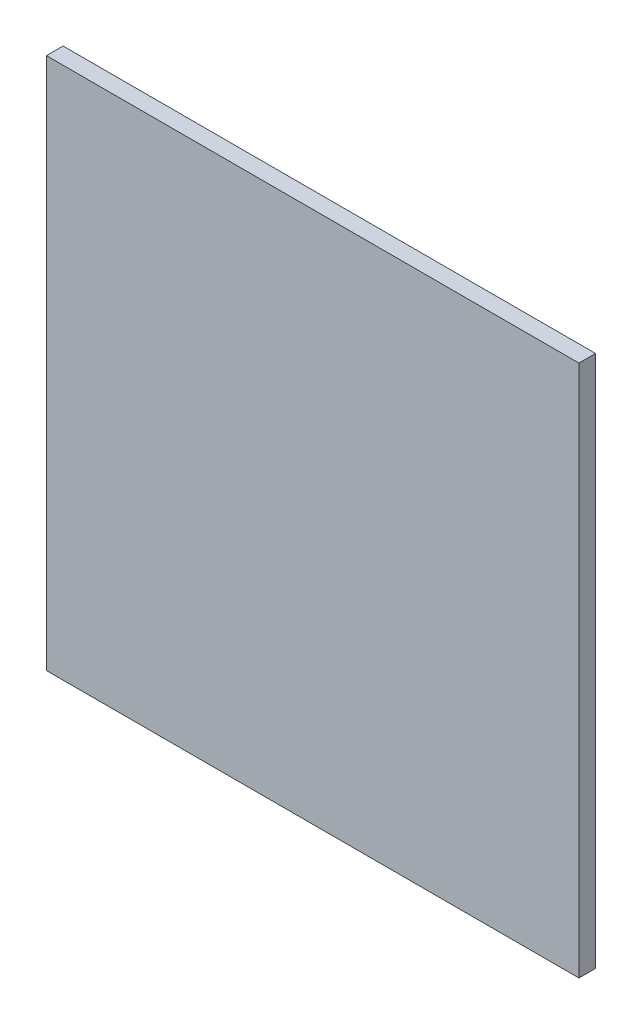
ISO-10303-21;
HEADER;
FILE_DESCRIPTION(('STEP AP214'),'2;1');
FILE_NAME('part.step','',(''),(''),'','','');
FILE_SCHEMA(('AUTOMOTIVE_DESIGN { 1 0 10303 214 1 1 1 1 }'));
ENDSEC;
DATA;
#1=APPLICATION_CONTEXT('core data for automotive mechanical design processes');
#2=APPLICATION_PROTOCOL_DEFINITION('international standard','automotive_design',2000,#1);
#3=PRODUCT_CONTEXT('',#1,'mechanical');
#4=PRODUCT('Part','Part','',(#3));
#5=PRODUCT_RELATED_PRODUCT_CATEGORY('part','',(#4));
#6=PRODUCT_DEFINITION_FORMATION('','',#4);
#7=PRODUCT_DEFINITION_CONTEXT('part definition',#1,'design');
#8=PRODUCT_DEFINITION('design','',#6,#7);
#9=PRODUCT_DEFINITION_SHAPE('','',#8);
#10=(LENGTH_UNIT() NAMED_UNIT(*) SI_UNIT(.MILLI.,.METRE.));
#11=(NAMED_UNIT(*) PLANE_ANGLE_UNIT() SI_UNIT($,.RADIAN.));
#12=(NAMED_UNIT(*) SI_UNIT($,.STERADIAN.) SOLID_ANGLE_UNIT());
#13=UNCERTAINTY_MEASURE_WITH_UNIT(LENGTH_MEASURE(1.E-05),#10,'distance_accuracy_value','');
#14=(GEOMETRIC_REPRESENTATION_CONTEXT(3) GLOBAL_UNCERTAINTY_ASSIGNED_CONTEXT((#13)) GLOBAL_UNIT_ASSIGNED_CONTEXT((#10,
#11,#12)) REPRESENTATION_CONTEXT('',''));
#15=CARTESIAN_POINT('',(0.,0.,0.));
#16=DIRECTION('',(0.,0.,1.));
#17=DIRECTION('',(1.,0.,0.));
#18=AXIS2_PLACEMENT_3D('',#15,#16,#17);
#19=CARTESIAN_POINT('',(0.,0.,-58.));
#20=DIRECTION('',(0.,0.,-1.));
#21=DIRECTION('',(-1.,0.,0.));
#22=AXIS2_PLACEMENT_3D('',#19,#20,#21);
#23=PLANE('',#22);
#24=DIRECTION('',(0.,-1.,0.));
#25=VECTOR('',#24,1.);
#26=CARTESIAN_POINT('',(-130.,30.,-58.));
#27=LINE('',#26,#25);
#28=CARTESIAN_POINT('',(-130.,30.,-58.));
#29=VERTEX_POINT('',#28);
#30=CARTESIAN_POINT('',(-130.,-130.,-58.));
#31=VERTEX_POINT('',#30);
#32=EDGE_CURVE('E305',#29,#31,#27,.T.);
#33=ORIENTED_EDGE('',*,*,#32,.F.);
#34=DIRECTION('',(-1.,0.,0.));
#35=VECTOR('',#34,1.);
#36=CARTESIAN_POINT('',(30.,30.,-58.));
#37=LINE('',#36,#35);
#38=CARTESIAN_POINT('',(30.,30.,-58.));
#39=VERTEX_POINT('',#38);
#40=EDGE_CURVE('E318',#39,#29,#37,.T.);
#41=ORIENTED_EDGE('',*,*,#40,.F.);
#42=DIRECTION('',(0.,1.,0.));
#43=VECTOR('',#42,1.);
#44=CARTESIAN_POINT('',(30.,30.,-58.));
#45=LINE('',#44,#43);
#46=CARTESIAN_POINT('',(30.,-130.,-58.));
#47=VERTEX_POINT('',#46);
#48=EDGE_CURVE('E314',#47,#39,#45,.T.);
#49=ORIENTED_EDGE('',*,*,#48,.F.);
#50=DIRECTION('',(1.,0.,0.));
#51=VECTOR('',#50,1.);
#52=CARTESIAN_POINT('',(30.,-130.,-58.));
#53=LINE('',#52,#51);
#54=EDGE_CURVE('E309',#31,#47,#53,.T.);
#55=ORIENTED_EDGE('',*,*,#54,.F.);
#56=EDGE_LOOP('',(#33,#41,#49,#55));
#57=FACE_BOUND('',#56,.T.);
#58=DIRECTION('',(-1.,0.,0.));
#59=VECTOR('',#58,1.);
#60=CARTESIAN_POINT('',(0.,20.,-58.));
#61=LINE('',#60,#59);
#62=CARTESIAN_POINT('',(20.,20.,-58.));
#63=VERTEX_POINT('',#62);
#64=CARTESIAN_POINT('',(-120.,20.,-58.));
#65=VERTEX_POINT('',#64);
#66=EDGE_CURVE('E273',#63,#65,#61,.T.);
#67=ORIENTED_EDGE('',*,*,#66,.T.);
#68=DIRECTION('',(0.,-1.,0.));
#69=VECTOR('',#68,1.);
#70=CARTESIAN_POINT('',(-120.,0.,-58.));
#71=LINE('',#70,#69);
#72=CARTESIAN_POINT('',(-120.,-120.,-58.));
#73=VERTEX_POINT('',#72);
#74=EDGE_CURVE('E269',#65,#73,#71,.T.);
#75=ORIENTED_EDGE('',*,*,#74,.T.);
#76=DIRECTION('',(-1.,0.,0.));
#77=VECTOR('',#76,1.);
#78=CARTESIAN_POINT('',(0.,-120.,-58.));
#79=LINE('',#78,#77);
#80=CARTESIAN_POINT('',(20.,-120.,-58.));
#81=VERTEX_POINT('',#80);
#82=EDGE_CURVE('E251',#81,#73,#79,.T.);
#83=ORIENTED_EDGE('',*,*,#82,.F.);
#84=DIRECTION('',(0.,-1.,0.));
#85=VECTOR('',#84,1.);
#86=CARTESIAN_POINT('',(20.,0.,-58.));
#87=LINE('',#86,#85);
#88=EDGE_CURVE('E277',#63,#81,#87,.T.);
#89=ORIENTED_EDGE('',*,*,#88,.F.);
#90=EDGE_LOOP('',(#67,#75,#83,#89));
#91=FACE_BOUND('',#90,.T.);
#92=ADVANCED_FACE('F45',(#57,#91),#23,.T.);
#93=CARTESIAN_POINT('',(110.,110.,10.));
#94=DIRECTION('',(-1.,0.,0.));
#95=DIRECTION('',(0.,-1.,0.));
#96=AXIS2_PLACEMENT_3D('',#93,#94,#95);
#97=PLANE('',#96);
#98=DIRECTION('',(0.,1.,0.));
#99=VECTOR('',#98,1.);
#100=CARTESIAN_POINT('',(110.,110.,0.));
#101=LINE('',#100,#99);
#102=CARTESIAN_POINT('',(110.,-210.,0.));
#103=VERTEX_POINT('',#102);
#104=CARTESIAN_POINT('',(110.,110.,0.));
#105=VERTEX_POINT('',#104);
#106=EDGE_CURVE('E341',#103,#105,#101,.T.);
#107=ORIENTED_EDGE('',*,*,#106,.T.);
#108=DIRECTION('',(0.,0.,-1.));
#109=VECTOR('',#108,1.);
#110=CARTESIAN_POINT('',(110.,110.,10.));
#111=LINE('',#110,#109);
#112=CARTESIAN_POINT('',(110.,110.,10.));
#113=VERTEX_POINT('',#112);
#114=EDGE_CURVE('E387',#113,#105,#111,.T.);
#115=ORIENTED_EDGE('',*,*,#114,.F.);
#116=DIRECTION('',(0.,1.,0.));
#117=VECTOR('',#116,1.);
#118=CARTESIAN_POINT('',(110.,110.,10.));
#119=LINE('',#118,#117);
#120=CARTESIAN_POINT('',(110.,-210.,10.));
#121=VERTEX_POINT('',#120);
#122=EDGE_CURVE('E350',#121,#113,#119,.T.);
#123=ORIENTED_EDGE('',*,*,#122,.F.);
#124=DIRECTION('',(0.,0.,-1.));
#125=VECTOR('',#124,1.);
#126=CARTESIAN_POINT('',(110.,-210.,10.));
#127=LINE('',#126,#125);
#128=EDGE_CURVE('E364',#121,#103,#127,.T.);
#129=ORIENTED_EDGE('',*,*,#128,.T.);
#130=EDGE_LOOP('',(#107,#115,#123,#129));
#131=FACE_BOUND('',#130,.T.);
#132=ADVANCED_FACE('F47',(#131),#97,.F.);
#133=CARTESIAN_POINT('',(-210.,110.,10.));
#134=DIRECTION('',(0.,-1.,0.));
#135=DIRECTION('',(0.,0.,-1.));
#136=AXIS2_PLACEMENT_3D('',#133,#134,#135);
#137=PLANE('',#136);
#138=DIRECTION('',(-1.,0.,0.));
#139=VECTOR('',#138,1.);
#140=CARTESIAN_POINT('',(-210.,110.,0.));
#141=LINE('',#140,#139);
#142=CARTESIAN_POINT('',(-210.,110.,0.));
#143=VERTEX_POINT('',#142);
#144=EDGE_CURVE('E368',#105,#143,#141,.T.);
#145=ORIENTED_EDGE('',*,*,#144,.T.);
#146=DIRECTION('',(0.,0.,-1.));
#147=VECTOR('',#146,1.);
#148=CARTESIAN_POINT('',(-210.,110.,10.));
#149=LINE('',#148,#147);
#150=CARTESIAN_POINT('',(-210.,110.,10.));
#151=VERTEX_POINT('',#150);
#152=EDGE_CURVE('E383',#151,#143,#149,.T.);
#153=ORIENTED_EDGE('',*,*,#152,.F.);
#154=DIRECTION('',(-1.,0.,0.));
#155=VECTOR('',#154,1.);
#156=CARTESIAN_POINT('',(-210.,110.,10.));
#157=LINE('',#156,#155);
#158=EDGE_CURVE('E354',#113,#151,#157,.T.);
#159=ORIENTED_EDGE('',*,*,#158,.F.);
#160=ORIENTED_EDGE('',*,*,#114,.T.);
#161=EDGE_LOOP('',(#145,#153,#159,#160));
#162=FACE_BOUND('',#161,.T.);
#163=ADVANCED_FACE('F444',(#162),#137,.F.);
#164=CARTESIAN_POINT('',(-210.,110.,10.));
#165=DIRECTION('',(1.,0.,0.));
#166=DIRECTION('',(0.,1.,0.));
#167=AXIS2_PLACEMENT_3D('',#164,#165,#166);
#168=PLANE('',#167);
#169=DIRECTION('',(0.,-1.,0.));
#170=VECTOR('',#169,1.);
#171=CARTESIAN_POINT('',(-210.,110.,0.));
#172=LINE('',#171,#170);
#173=CARTESIAN_POINT('',(-210.,-210.,0.));
#174=VERTEX_POINT('',#173);
#175=EDGE_CURVE('E371',#143,#174,#172,.T.);
#176=ORIENTED_EDGE('',*,*,#175,.T.);
#177=DIRECTION('',(0.,0.,-1.));
#178=VECTOR('',#177,1.);
#179=CARTESIAN_POINT('',(-210.,-210.,10.));
#180=LINE('',#179,#178);
#181=CARTESIAN_POINT('',(-210.,-210.,10.));
#182=VERTEX_POINT('',#181);
#183=EDGE_CURVE('E379',#182,#174,#180,.T.);
#184=ORIENTED_EDGE('',*,*,#183,.F.);
#185=DIRECTION('',(0.,-1.,0.));
#186=VECTOR('',#185,1.);
#187=CARTESIAN_POINT('',(-210.,110.,10.));
#188=LINE('',#187,#186);
#189=EDGE_CURVE('E358',#151,#182,#188,.T.);
#190=ORIENTED_EDGE('',*,*,#189,.F.);
#191=ORIENTED_EDGE('',*,*,#152,.T.);
#192=EDGE_LOOP('',(#176,#184,#190,#191));
#193=FACE_BOUND('',#192,.T.);
#194=ADVANCED_FACE('F538',(#193),#168,.F.);
#195=CARTESIAN_POINT('',(-210.,-210.,10.));
#196=DIRECTION('',(0.,1.,0.));
#197=DIRECTION('',(0.,0.,1.));
#198=AXIS2_PLACEMENT_3D('',#195,#196,#197);
#199=PLANE('',#198);
#200=DIRECTION('',(1.,0.,0.));
#201=VECTOR('',#200,1.);
#202=CARTESIAN_POINT('',(-210.,-210.,0.));
#203=LINE('',#202,#201);
#204=EDGE_CURVE('E355',#174,#103,#203,.T.);
#205=ORIENTED_EDGE('',*,*,#204,.T.);
#206=ORIENTED_EDGE('',*,*,#128,.F.);
#207=DIRECTION('',(1.,0.,0.));
#208=VECTOR('',#207,1.);
#209=CARTESIAN_POINT('',(-210.,-210.,10.));
#210=LINE('',#209,#208);
#211=EDGE_CURVE('E361',#182,#121,#210,.T.);
#212=ORIENTED_EDGE('',*,*,#211,.F.);
#213=ORIENTED_EDGE('',*,*,#183,.T.);
#214=EDGE_LOOP('',(#205,#206,#212,#213));
#215=FACE_BOUND('',#214,.T.);
#216=ADVANCED_FACE('F533',(#215),#199,.F.);
#217=CARTESIAN_POINT('',(0.,0.,10.));
#218=DIRECTION('',(0.,0.,1.));
#219=DIRECTION('',(1.,0.,0.));
#220=AXIS2_PLACEMENT_3D('',#217,#218,#219);
#221=PLANE('',#220);
#222=ORIENTED_EDGE('',*,*,#122,.T.);
#223=ORIENTED_EDGE('',*,*,#158,.T.);
#224=ORIENTED_EDGE('',*,*,#189,.T.);
#225=ORIENTED_EDGE('',*,*,#211,.T.);
#226=EDGE_LOOP('',(#222,#223,#224,#225));
#227=FACE_BOUND('',#226,.T.);
#228=ADVANCED_FACE('F530',(#227),#221,.T.);
#229=CARTESIAN_POINT('',(0.,0.,0.));
#230=DIRECTION('',(0.,0.,1.));
#231=DIRECTION('',(1.,0.,0.));
#232=AXIS2_PLACEMENT_3D('',#229,#230,#231);
#233=PLANE('',#232);
#234=DIRECTION('',(-1.,0.,0.));
#235=VECTOR('',#234,1.);
#236=CARTESIAN_POINT('',(30.,30.,0.));
#237=LINE('',#236,#235);
#238=CARTESIAN_POINT('',(30.,30.,0.));
#239=VERTEX_POINT('',#238);
#240=CARTESIAN_POINT('',(-130.,30.,0.));
#241=VERTEX_POINT('',#240);
#242=EDGE_CURVE('E310',#239,#241,#237,.T.);
#243=ORIENTED_EDGE('',*,*,#242,.T.);
#244=DIRECTION('',(0.,-1.,0.));
#245=VECTOR('',#244,1.);
#246=CARTESIAN_POINT('',(-130.,30.,0.));
#247=LINE('',#246,#245);
#248=CARTESIAN_POINT('',(-130.,-130.,0.));
#249=VERTEX_POINT('',#248);
#250=EDGE_CURVE('E301',#241,#249,#247,.T.);
#251=ORIENTED_EDGE('',*,*,#250,.T.);
#252=DIRECTION('',(1.,0.,0.));
#253=VECTOR('',#252,1.);
#254=CARTESIAN_POINT('',(30.,-130.,0.));
#255=LINE('',#254,#253);
#256=CARTESIAN_POINT('',(-60.,-130.,0.));
#257=VERTEX_POINT('',#256);
#258=EDGE_CURVE('E326',#249,#257,#255,.T.);
#259=ORIENTED_EDGE('',*,*,#258,.T.);
#260=DIRECTION('',(0.,-1.,0.));
#261=VECTOR('',#260,1.);
#262=CARTESIAN_POINT('',(-60.,-61.,0.));
#263=LINE('',#262,#261);
#264=CARTESIAN_POINT('',(-60.,-120.,0.));
#265=VERTEX_POINT('',#264);
#266=EDGE_CURVE('E211',#265,#257,#263,.T.);
#267=ORIENTED_EDGE('',*,*,#266,.F.);
#268=DIRECTION('',(-1.,0.,0.));
#269=VECTOR('',#268,1.);
#270=CARTESIAN_POINT('',(0.,-120.,0.));
#271=LINE('',#270,#269);
#272=CARTESIAN_POINT('',(-40.,-120.,0.));
#273=VERTEX_POINT('',#272);
#274=EDGE_CURVE('E233',#273,#265,#271,.T.);
#275=ORIENTED_EDGE('',*,*,#274,.F.);
#276=DIRECTION('',(0.,-1.,0.));
#277=VECTOR('',#276,1.);
#278=CARTESIAN_POINT('',(-40.,-61.,0.));
#279=LINE('',#278,#277);
#280=CARTESIAN_POINT('',(-40.,-130.,0.));
#281=VERTEX_POINT('',#280);
#282=EDGE_CURVE('E216',#273,#281,#279,.T.);
#283=ORIENTED_EDGE('',*,*,#282,.T.);
#284=CARTESIAN_POINT('',(30.,-130.,0.));
#285=VERTEX_POINT('',#284);
#286=EDGE_CURVE('E204',#281,#285,#255,.T.);
#287=ORIENTED_EDGE('',*,*,#286,.T.);
#288=DIRECTION('',(0.,1.,0.));
#289=VECTOR('',#288,1.);
#290=CARTESIAN_POINT('',(30.,30.,0.));
#291=LINE('',#290,#289);
#292=EDGE_CURVE('E330',#285,#239,#291,.T.);
#293=ORIENTED_EDGE('',*,*,#292,.T.);
#294=EDGE_LOOP('',(#243,#251,#259,#267,#275,#283,#287,#293));
#295=FACE_BOUND('',#294,.T.);
#296=ORIENTED_EDGE('',*,*,#106,.F.);
#297=ORIENTED_EDGE('',*,*,#204,.F.);
#298=ORIENTED_EDGE('',*,*,#175,.F.);
#299=ORIENTED_EDGE('',*,*,#144,.F.);
#300=EDGE_LOOP('',(#296,#297,#298,#299));
#301=FACE_BOUND('',#300,.T.);
#302=ADVANCED_FACE('F506',(#295,#301),#233,.F.);
#303=CARTESIAN_POINT('',(-130.,30.,-58.));
#304=DIRECTION('',(-1.,0.,0.));
#305=DIRECTION('',(0.,0.,1.));
#306=AXIS2_PLACEMENT_3D('',#303,#304,#305);
#307=PLANE('',#306);
#308=ORIENTED_EDGE('',*,*,#250,.F.);
#309=DIRECTION('',(0.,0.,1.));
#310=VECTOR('',#309,1.);
#311=CARTESIAN_POINT('',(-130.,30.,-58.));
#312=LINE('',#311,#310);
#313=EDGE_CURVE('E337',#29,#241,#312,.T.);
#314=ORIENTED_EDGE('',*,*,#313,.F.);
#315=ORIENTED_EDGE('',*,*,#32,.T.);
#316=DIRECTION('',(0.,0.,1.));
#317=VECTOR('',#316,1.);
#318=CARTESIAN_POINT('',(-130.,-130.,-58.));
#319=LINE('',#318,#317);
#320=EDGE_CURVE('E322',#31,#249,#319,.T.);
#321=ORIENTED_EDGE('',*,*,#320,.T.);
#322=EDGE_LOOP('',(#308,#314,#315,#321));
#323=FACE_BOUND('',#322,.T.);
#324=ADVANCED_FACE('F513',(#323),#307,.T.);
#325=CARTESIAN_POINT('',(30.,30.,-58.));
#326=DIRECTION('',(0.,1.,0.));
#327=DIRECTION('',(0.,0.,1.));
#328=AXIS2_PLACEMENT_3D('',#325,#326,#327);
#329=PLANE('',#328);
#330=ORIENTED_EDGE('',*,*,#242,.F.);
#331=DIRECTION('',(0.,0.,1.));
#332=VECTOR('',#331,1.);
#333=CARTESIAN_POINT('',(30.,30.,-58.));
#334=LINE('',#333,#332);
#335=EDGE_CURVE('E342',#39,#239,#334,.T.);
#336=ORIENTED_EDGE('',*,*,#335,.F.);
#337=ORIENTED_EDGE('',*,*,#40,.T.);
#338=ORIENTED_EDGE('',*,*,#313,.T.);
#339=EDGE_LOOP('',(#330,#336,#337,#338));
#340=FACE_BOUND('',#339,.T.);
#341=ADVANCED_FACE('F515',(#340),#329,.T.);
#342=CARTESIAN_POINT('',(30.,30.,-58.));
#343=DIRECTION('',(1.,0.,0.));
#344=DIRECTION('',(0.,0.,-1.));
#345=AXIS2_PLACEMENT_3D('',#342,#343,#344);
#346=PLANE('',#345);
#347=ORIENTED_EDGE('',*,*,#292,.F.);
#348=DIRECTION('',(0.,0.,1.));
#349=VECTOR('',#348,1.);
#350=CARTESIAN_POINT('',(30.,-130.,-58.));
#351=LINE('',#350,#349);
#352=EDGE_CURVE('E345',#47,#285,#351,.T.);
#353=ORIENTED_EDGE('',*,*,#352,.F.);
#354=ORIENTED_EDGE('',*,*,#48,.T.);
#355=ORIENTED_EDGE('',*,*,#335,.T.);
#356=EDGE_LOOP('',(#347,#353,#354,#355));
#357=FACE_BOUND('',#356,.T.);
#358=ADVANCED_FACE('F520',(#357),#346,.T.);
#359=CARTESIAN_POINT('',(30.,-130.,-58.));
#360=DIRECTION('',(0.,-1.,0.));
#361=DIRECTION('',(0.,0.,-1.));
#362=AXIS2_PLACEMENT_3D('',#359,#360,#361);
#363=PLANE('',#362);
#364=DIRECTION('',(0.,0.,-1.));
#365=VECTOR('',#364,1.);
#366=CARTESIAN_POINT('',(-60.,-130.,0.));
#367=LINE('',#366,#365);
#368=CARTESIAN_POINT('',(-60.,-130.,-10.));
#369=VERTEX_POINT('',#368);
#370=EDGE_CURVE('E61',#257,#369,#367,.T.);
#371=ORIENTED_EDGE('',*,*,#370,.F.);
#372=ORIENTED_EDGE('',*,*,#258,.F.);
#373=ORIENTED_EDGE('',*,*,#320,.F.);
#374=ORIENTED_EDGE('',*,*,#54,.T.);
#375=ORIENTED_EDGE('',*,*,#352,.T.);
#376=ORIENTED_EDGE('',*,*,#286,.F.);
#377=DIRECTION('',(0.,0.,1.));
#378=VECTOR('',#377,1.);
#379=CARTESIAN_POINT('',(-40.,-130.,0.));
#380=LINE('',#379,#378);
#381=CARTESIAN_POINT('',(-40.,-130.,-10.));
#382=VERTEX_POINT('',#381);
#383=EDGE_CURVE('E186',#382,#281,#380,.T.);
#384=ORIENTED_EDGE('',*,*,#383,.F.);
#385=DIRECTION('',(1.,0.,0.));
#386=VECTOR('',#385,1.);
#387=CARTESIAN_POINT('',(-60.,-130.,-10.));
#388=LINE('',#387,#386);
#389=EDGE_CURVE('E196',#369,#382,#388,.T.);
#390=ORIENTED_EDGE('',*,*,#389,.F.);
#391=EDGE_LOOP('',(#371,#372,#373,#374,#375,#376,#384,#390));
#392=FACE_BOUND('',#391,.T.);
#393=ADVANCED_FACE('F202',(#392),#363,.T.);
#394=CARTESIAN_POINT('',(-120.,0.,1.99999999999999));
#395=DIRECTION('',(1.,0.,0.));
#396=DIRECTION('',(0.,1.,0.));
#397=AXIS2_PLACEMENT_3D('',#394,#395,#396);
#398=PLANE('',#397);
#399=ORIENTED_EDGE('',*,*,#74,.F.);
#400=DIRECTION('',(0.,0.,-1.));
#401=VECTOR('',#400,1.);
#402=CARTESIAN_POINT('',(-120.,20.,1.99999999999999));
#403=LINE('',#402,#401);
#404=CARTESIAN_POINT('',(-120.,20.,1.99999999999999));
#405=VERTEX_POINT('',#404);
#406=EDGE_CURVE('E265',#405,#65,#403,.T.);
#407=ORIENTED_EDGE('',*,*,#406,.F.);
#408=DIRECTION('',(0.,-1.,0.));
#409=VECTOR('',#408,1.);
#410=CARTESIAN_POINT('',(-120.,0.,1.99999999999999));
#411=LINE('',#410,#409);
#412=CARTESIAN_POINT('',(-120.,-120.,1.99999999999999));
#413=VERTEX_POINT('',#412);
#414=EDGE_CURVE('E250',#405,#413,#411,.T.);
#415=ORIENTED_EDGE('',*,*,#414,.T.);
#416=DIRECTION('',(0.,0.,-1.));
#417=VECTOR('',#416,1.);
#418=CARTESIAN_POINT('',(-120.,-120.,1.99999999999999));
#419=LINE('',#418,#417);
#420=EDGE_CURVE('E284',#413,#73,#419,.T.);
#421=ORIENTED_EDGE('',*,*,#420,.T.);
#422=EDGE_LOOP('',(#399,#407,#415,#421));
#423=FACE_BOUND('',#422,.T.);
#424=ADVANCED_FACE('F479',(#423),#398,.T.);
#425=CARTESIAN_POINT('',(0.,-120.,1.99999999999999));
#426=DIRECTION('',(0.,-1.,0.));
#427=DIRECTION('',(0.,0.,-1.));
#428=AXIS2_PLACEMENT_3D('',#425,#426,#427);
#429=PLANE('',#428);
#430=ORIENTED_EDGE('',*,*,#274,.T.);
#431=DIRECTION('',(0.,0.,-1.));
#432=VECTOR('',#431,1.);
#433=CARTESIAN_POINT('',(-60.,-120.,1.99999999999999));
#434=LINE('',#433,#432);
#435=CARTESIAN_POINT('',(-60.,-120.,-10.));
#436=VERTEX_POINT('',#435);
#437=EDGE_CURVE('E241',#265,#436,#434,.T.);
#438=ORIENTED_EDGE('',*,*,#437,.T.);
#439=DIRECTION('',(1.,0.,0.));
#440=VECTOR('',#439,1.);
#441=CARTESIAN_POINT('',(0.,-120.,-10.));
#442=LINE('',#441,#440);
#443=CARTESIAN_POINT('',(-40.,-120.,-10.));
#444=VERTEX_POINT('',#443);
#445=EDGE_CURVE('E222',#436,#444,#442,.T.);
#446=ORIENTED_EDGE('',*,*,#445,.T.);
#447=DIRECTION('',(0.,0.,1.));
#448=VECTOR('',#447,1.);
#449=CARTESIAN_POINT('',(-40.,-120.,1.99999999999999));
#450=LINE('',#449,#448);
#451=EDGE_CURVE('E189',#444,#273,#450,.T.);
#452=ORIENTED_EDGE('',*,*,#451,.T.);
#453=EDGE_LOOP('',(#430,#438,#446,#452));
#454=FACE_BOUND('',#453,.T.);
#455=ORIENTED_EDGE('',*,*,#82,.T.);
#456=ORIENTED_EDGE('',*,*,#420,.F.);
#457=DIRECTION('',(-1.,0.,0.));
#458=VECTOR('',#457,1.);
#459=CARTESIAN_POINT('',(0.,-120.,1.99999999999999));
#460=LINE('',#459,#458);
#461=CARTESIAN_POINT('',(20.,-120.,1.99999999999999));
#462=VERTEX_POINT('',#461);
#463=EDGE_CURVE('E261',#462,#413,#460,.T.);
#464=ORIENTED_EDGE('',*,*,#463,.F.);
#465=DIRECTION('',(0.,0.,-1.));
#466=VECTOR('',#465,1.);
#467=CARTESIAN_POINT('',(20.,-120.,1.99999999999999));
#468=LINE('',#467,#466);
#469=EDGE_CURVE('E288',#462,#81,#468,.T.);
#470=ORIENTED_EDGE('',*,*,#469,.T.);
#471=EDGE_LOOP('',(#455,#456,#464,#470));
#472=FACE_BOUND('',#471,.T.);
#473=ADVANCED_FACE('F474',(#454,#472),#429,.F.);
#474=CARTESIAN_POINT('',(20.,0.,1.99999999999999));
#475=DIRECTION('',(1.,0.,0.));
#476=DIRECTION('',(0.,1.,0.));
#477=AXIS2_PLACEMENT_3D('',#474,#475,#476);
#478=PLANE('',#477);
#479=ORIENTED_EDGE('',*,*,#88,.T.);
#480=ORIENTED_EDGE('',*,*,#469,.F.);
#481=DIRECTION('',(0.,-1.,0.));
#482=VECTOR('',#481,1.);
#483=CARTESIAN_POINT('',(20.,0.,1.99999999999999));
#484=LINE('',#483,#482);
#485=CARTESIAN_POINT('',(20.,20.,1.99999999999999));
#486=VERTEX_POINT('',#485);
#487=EDGE_CURVE('E257',#486,#462,#484,.T.);
#488=ORIENTED_EDGE('',*,*,#487,.F.);
#489=DIRECTION('',(0.,0.,-1.));
#490=VECTOR('',#489,1.);
#491=CARTESIAN_POINT('',(20.,20.,1.99999999999999));
#492=LINE('',#491,#490);
#493=EDGE_CURVE('E291',#486,#63,#492,.T.);
#494=ORIENTED_EDGE('',*,*,#493,.T.);
#495=EDGE_LOOP('',(#479,#480,#488,#494));
#496=FACE_BOUND('',#495,.T.);
#497=ADVANCED_FACE('F463',(#496),#478,.F.);
#498=CARTESIAN_POINT('',(-50.,-50.,1.99999999999999));
#499=DIRECTION('',(0.,0.,-1.));
#500=DIRECTION('',(-1.,0.,0.));
#501=AXIS2_PLACEMENT_3D('',#498,#499,#500);
#502=CYLINDRICAL_SURFACE('',#501,35.);
#503=DIRECTION('',(0.,0.,-1.));
#504=VECTOR('',#503,1.);
#505=CARTESIAN_POINT('',(-60.,-83.5410196624969,1.99999999999999));
#506=LINE('',#505,#504);
#507=CARTESIAN_POINT('',(-60.,-83.5410196624969,0.));
#508=VERTEX_POINT('',#507);
#509=CARTESIAN_POINT('',(-60.,-83.5410196624969,-10.));
#510=VERTEX_POINT('',#509);
#511=EDGE_CURVE('E237',#508,#510,#506,.T.);
#512=ORIENTED_EDGE('',*,*,#511,.F.);
#513=CARTESIAN_POINT('',(-50.,-50.,0.));
#514=DIRECTION('',(0.,0.,1.));
#515=DIRECTION('',(1.,0.,0.));
#516=AXIS2_PLACEMENT_3D('',#513,#514,#515);
#517=CIRCLE('',#516,35.);
#518=CARTESIAN_POINT('',(-40.,-83.5410196624969,0.));
#519=VERTEX_POINT('',#518);
#520=EDGE_CURVE('E230',#519,#508,#517,.F.);
#521=ORIENTED_EDGE('',*,*,#520,.F.);
#522=DIRECTION('',(0.,0.,-1.));
#523=VECTOR('',#522,1.);
#524=CARTESIAN_POINT('',(-40.,-83.5410196624969,1.99999999999999));
#525=LINE('',#524,#523);
#526=CARTESIAN_POINT('',(-40.,-83.5410196624969,-10.));
#527=VERTEX_POINT('',#526);
#528=EDGE_CURVE('E225',#527,#519,#525,.F.);
#529=ORIENTED_EDGE('',*,*,#528,.F.);
#530=CARTESIAN_POINT('',(-50.,-50.,-10.));
#531=DIRECTION('',(0.,0.,-1.));
#532=DIRECTION('',(-1.,0.,0.));
#533=AXIS2_PLACEMENT_3D('',#530,#531,#532);
#534=CIRCLE('',#533,35.);
#535=EDGE_CURVE('E219',#510,#527,#534,.F.);
#536=ORIENTED_EDGE('',*,*,#535,.F.);
#537=EDGE_LOOP('',(#512,#521,#529,#536));
#538=FACE_BOUND('',#537,.T.);
#539=CARTESIAN_POINT('',(-50.,-50.,1.99999999999999));
#540=DIRECTION('',(0.,0.,-1.));
#541=DIRECTION('',(-1.,0.,0.));
#542=AXIS2_PLACEMENT_3D('',#539,#540,#541);
#543=CIRCLE('',#542,35.);
#544=CARTESIAN_POINT('',(-85.,-50.,1.99999999999999));
#545=VERTEX_POINT('',#544);
#546=EDGE_CURVE('E246',#545,#545,#543,.T.);
#547=ORIENTED_EDGE('',*,*,#546,.T.);
#548=EDGE_LOOP('',(#547));
#549=FACE_BOUND('',#548,.T.);
#550=CARTESIAN_POINT('',(-50.,-50.,-58.));
#551=DIRECTION('',(0.,0.,-1.));
#552=DIRECTION('',(-1.,0.,0.));
#553=AXIS2_PLACEMENT_3D('',#550,#551,#552);
#554=CIRCLE('',#553,35.);
#555=CARTESIAN_POINT('',(-85.,-50.,-58.));
#556=VERTEX_POINT('',#555);
#557=EDGE_CURVE('E245',#556,#556,#554,.T.);
#558=ORIENTED_EDGE('',*,*,#557,.F.);
#559=EDGE_LOOP('',(#558));
#560=FACE_BOUND('',#559,.T.);
#561=ADVANCED_FACE('F422',(#538,#549,#560),#502,.T.);
#562=CARTESIAN_POINT('',(0.,20.,1.99999999999999));
#563=DIRECTION('',(0.,-1.,0.));
#564=DIRECTION('',(0.,0.,-1.));
#565=AXIS2_PLACEMENT_3D('',#562,#563,#564);
#566=PLANE('',#565);
#567=ORIENTED_EDGE('',*,*,#66,.F.);
#568=ORIENTED_EDGE('',*,*,#493,.F.);
#569=DIRECTION('',(-1.,0.,0.));
#570=VECTOR('',#569,1.);
#571=CARTESIAN_POINT('',(0.,20.,1.99999999999999));
#572=LINE('',#571,#570);
#573=EDGE_CURVE('E254',#486,#405,#572,.T.);
#574=ORIENTED_EDGE('',*,*,#573,.T.);
#575=ORIENTED_EDGE('',*,*,#406,.T.);
#576=EDGE_LOOP('',(#567,#568,#574,#575));
#577=FACE_BOUND('',#576,.T.);
#578=ADVANCED_FACE('F462',(#577),#566,.T.);
#579=CARTESIAN_POINT('',(0.,0.,1.99999999999999));
#580=DIRECTION('',(0.,0.,-1.));
#581=DIRECTION('',(-1.,0.,0.));
#582=AXIS2_PLACEMENT_3D('',#579,#580,#581);
#583=PLANE('',#582);
#584=ORIENTED_EDGE('',*,*,#546,.F.);
#585=EDGE_LOOP('',(#584));
#586=FACE_BOUND('',#585,.T.);
#587=ORIENTED_EDGE('',*,*,#414,.F.);
#588=ORIENTED_EDGE('',*,*,#573,.F.);
#589=ORIENTED_EDGE('',*,*,#487,.T.);
#590=ORIENTED_EDGE('',*,*,#463,.T.);
#591=EDGE_LOOP('',(#587,#588,#589,#590));
#592=FACE_BOUND('',#591,.T.);
#593=ADVANCED_FACE('F470',(#586,#592),#583,.T.);
#594=CARTESIAN_POINT('',(-50.,-50.,0.));
#595=DIRECTION('',(0.,0.,-1.));
#596=DIRECTION('',(-1.,0.,0.));
#597=AXIS2_PLACEMENT_3D('',#594,#595,#596);
#598=PLANE('',#597);
#599=CARTESIAN_POINT('',(-50.,-50.,0.));
#600=DIRECTION('',(0.,0.,-1.));
#601=DIRECTION('',(-1.,0.,0.));
#602=AXIS2_PLACEMENT_3D('',#599,#600,#601);
#603=CIRCLE('',#602,19.);
#604=CARTESIAN_POINT('',(-60.,-66.1554944214035,0.));
#605=VERTEX_POINT('',#604);
#606=CARTESIAN_POINT('',(-40.,-66.1554944214035,0.));
#607=VERTEX_POINT('',#606);
#608=EDGE_CURVE('E297',#605,#607,#603,.T.);
#609=ORIENTED_EDGE('',*,*,#608,.T.);
#610=EDGE_CURVE('E215',#607,#519,#279,.T.);
#611=ORIENTED_EDGE('',*,*,#610,.T.);
#612=ORIENTED_EDGE('',*,*,#520,.T.);
#613=EDGE_CURVE('E214',#605,#508,#263,.T.);
#614=ORIENTED_EDGE('',*,*,#613,.F.);
#615=EDGE_LOOP('',(#609,#611,#612,#614));
#616=FACE_BOUND('',#615,.T.);
#617=ADVANCED_FACE('F406',(#616),#598,.T.);
#618=CARTESIAN_POINT('',(-50.,-50.,0.));
#619=DIRECTION('',(0.,0.,-1.));
#620=DIRECTION('',(-1.,0.,0.));
#621=AXIS2_PLACEMENT_3D('',#618,#619,#620);
#622=CYLINDRICAL_SURFACE('',#621,19.);
#623=ORIENTED_EDGE('',*,*,#608,.F.);
#624=DIRECTION('',(0.,0.,-1.));
#625=VECTOR('',#624,1.);
#626=CARTESIAN_POINT('',(-60.,-66.1554944214035,0.));
#627=LINE('',#626,#625);
#628=CARTESIAN_POINT('',(-60.,-66.1554944214035,-10.));
#629=VERTEX_POINT('',#628);
#630=EDGE_CURVE('E11',#605,#629,#627,.T.);
#631=ORIENTED_EDGE('',*,*,#630,.T.);
#632=CARTESIAN_POINT('',(-50.,-50.,-10.));
#633=DIRECTION('',(0.,0.,-1.));
#634=DIRECTION('',(-1.,0.,0.));
#635=AXIS2_PLACEMENT_3D('',#632,#633,#634);
#636=CIRCLE('',#635,19.);
#637=CARTESIAN_POINT('',(-40.,-66.1554944214035,-10.));
#638=VERTEX_POINT('',#637);
#639=EDGE_CURVE('E391',#629,#638,#636,.F.);
#640=ORIENTED_EDGE('',*,*,#639,.T.);
#641=DIRECTION('',(0.,0.,-1.));
#642=VECTOR('',#641,1.);
#643=CARTESIAN_POINT('',(-40.,-66.1554944214035,0.));
#644=LINE('',#643,#642);
#645=EDGE_CURVE('E54',#638,#607,#644,.F.);
#646=ORIENTED_EDGE('',*,*,#645,.T.);
#647=EDGE_LOOP('',(#623,#631,#640,#646));
#648=FACE_BOUND('',#647,.T.);
#649=CARTESIAN_POINT('',(-50.,-50.,-58.));
#650=DIRECTION('',(0.,0.,-1.));
#651=DIRECTION('',(-1.,0.,0.));
#652=AXIS2_PLACEMENT_3D('',#649,#650,#651);
#653=CIRCLE('',#652,19.);
#654=CARTESIAN_POINT('',(-69.,-50.,-58.));
#655=VERTEX_POINT('',#654);
#656=EDGE_CURVE('E287',#655,#655,#653,.T.);
#657=ORIENTED_EDGE('',*,*,#656,.T.);
#658=EDGE_LOOP('',(#657));
#659=FACE_BOUND('',#658,.T.);
#660=ADVANCED_FACE('F399',(#648,#659),#622,.F.);
#661=ORIENTED_EDGE('',*,*,#656,.F.);
#662=EDGE_LOOP('',(#661));
#663=FACE_BOUND('',#662,.T.);
#664=ORIENTED_EDGE('',*,*,#557,.T.);
#665=EDGE_LOOP('',(#664));
#666=FACE_BOUND('',#665,.T.);
#667=ADVANCED_FACE('F433',(#663,#666),#23,.T.);
#668=CARTESIAN_POINT('',(-60.,-61.,-10.));
#669=DIRECTION('',(0.,0.,-1.));
#670=DIRECTION('',(-1.,0.,0.));
#671=AXIS2_PLACEMENT_3D('',#668,#669,#670);
#672=PLANE('',#671);
#673=ORIENTED_EDGE('',*,*,#535,.T.);
#674=DIRECTION('',(0.,-1.,0.));
#675=VECTOR('',#674,1.);
#676=CARTESIAN_POINT('',(-40.,-61.,-10.));
#677=LINE('',#676,#675);
#678=EDGE_CURVE('E192',#638,#527,#677,.T.);
#679=ORIENTED_EDGE('',*,*,#678,.F.);
#680=ORIENTED_EDGE('',*,*,#639,.F.);
#681=DIRECTION('',(0.,-1.,0.));
#682=VECTOR('',#681,1.);
#683=CARTESIAN_POINT('',(-60.,-61.,-10.));
#684=LINE('',#683,#682);
#685=EDGE_CURVE('E193',#629,#510,#684,.T.);
#686=ORIENTED_EDGE('',*,*,#685,.T.);
#687=EDGE_LOOP('',(#673,#679,#680,#686));
#688=FACE_BOUND('',#687,.T.);
#689=ADVANCED_FACE('F417',(#688),#672,.F.);
#690=CARTESIAN_POINT('',(-40.,-61.,0.));
#691=DIRECTION('',(1.,0.,0.));
#692=DIRECTION('',(0.,0.,-1.));
#693=AXIS2_PLACEMENT_3D('',#690,#691,#692);
#694=PLANE('',#693);
#695=ORIENTED_EDGE('',*,*,#528,.T.);
#696=ORIENTED_EDGE('',*,*,#610,.F.);
#697=ORIENTED_EDGE('',*,*,#645,.F.);
#698=ORIENTED_EDGE('',*,*,#678,.T.);
#699=EDGE_LOOP('',(#695,#696,#697,#698));
#700=FACE_BOUND('',#699,.T.);
#701=ADVANCED_FACE('F424',(#700),#694,.F.);
#702=CARTESIAN_POINT('',(-60.,-61.,0.));
#703=DIRECTION('',(-1.,0.,0.));
#704=DIRECTION('',(0.,0.,1.));
#705=AXIS2_PLACEMENT_3D('',#702,#703,#704);
#706=PLANE('',#705);
#707=ORIENTED_EDGE('',*,*,#511,.T.);
#708=ORIENTED_EDGE('',*,*,#685,.F.);
#709=ORIENTED_EDGE('',*,*,#630,.F.);
#710=ORIENTED_EDGE('',*,*,#613,.T.);
#711=EDGE_LOOP('',(#707,#708,#709,#710));
#712=FACE_BOUND('',#711,.T.);
#713=ADVANCED_FACE('F419',(#712),#706,.F.);
#714=ORIENTED_EDGE('',*,*,#266,.T.);
#715=ORIENTED_EDGE('',*,*,#370,.T.);
#716=EDGE_CURVE('E198',#436,#369,#684,.T.);
#717=ORIENTED_EDGE('',*,*,#716,.F.);
#718=ORIENTED_EDGE('',*,*,#437,.F.);
#719=EDGE_LOOP('',(#714,#715,#717,#718));
#720=FACE_BOUND('',#719,.T.);
#721=ADVANCED_FACE('F431',(#720),#706,.F.);
#722=EDGE_CURVE('E69',#444,#382,#677,.T.);
#723=ORIENTED_EDGE('',*,*,#722,.T.);
#724=ORIENTED_EDGE('',*,*,#383,.T.);
#725=ORIENTED_EDGE('',*,*,#282,.F.);
#726=ORIENTED_EDGE('',*,*,#451,.F.);
#727=EDGE_LOOP('',(#723,#724,#725,#726));
#728=FACE_BOUND('',#727,.T.);
#729=ADVANCED_FACE('F183',(#728),#694,.F.);
#730=ORIENTED_EDGE('',*,*,#716,.T.);
#731=ORIENTED_EDGE('',*,*,#389,.T.);
#732=ORIENTED_EDGE('',*,*,#722,.F.);
#733=ORIENTED_EDGE('',*,*,#445,.F.);
#734=EDGE_LOOP('',(#730,#731,#732,#733));
#735=FACE_BOUND('',#734,.T.);
#736=ADVANCED_FACE('F197',(#735),#672,.F.);
#737=CLOSED_SHELL('',(#92,#132,#163,#194,#216,#228,#302,#324,#341,#358,#393,#424,#473,#497,#561,
#578,#593,#617,#660,#667,#689,#701,#713,#721,#729,#736));
#738=MANIFOLD_SOLID_BREP('B2',#737);
#739=ADVANCED_BREP_SHAPE_REPRESENTATION('',(#18,#738),#14);
#740=SHAPE_DEFINITION_REPRESENTATION(#9,#739);
ENDSEC;
END-ISO-10303-21;
